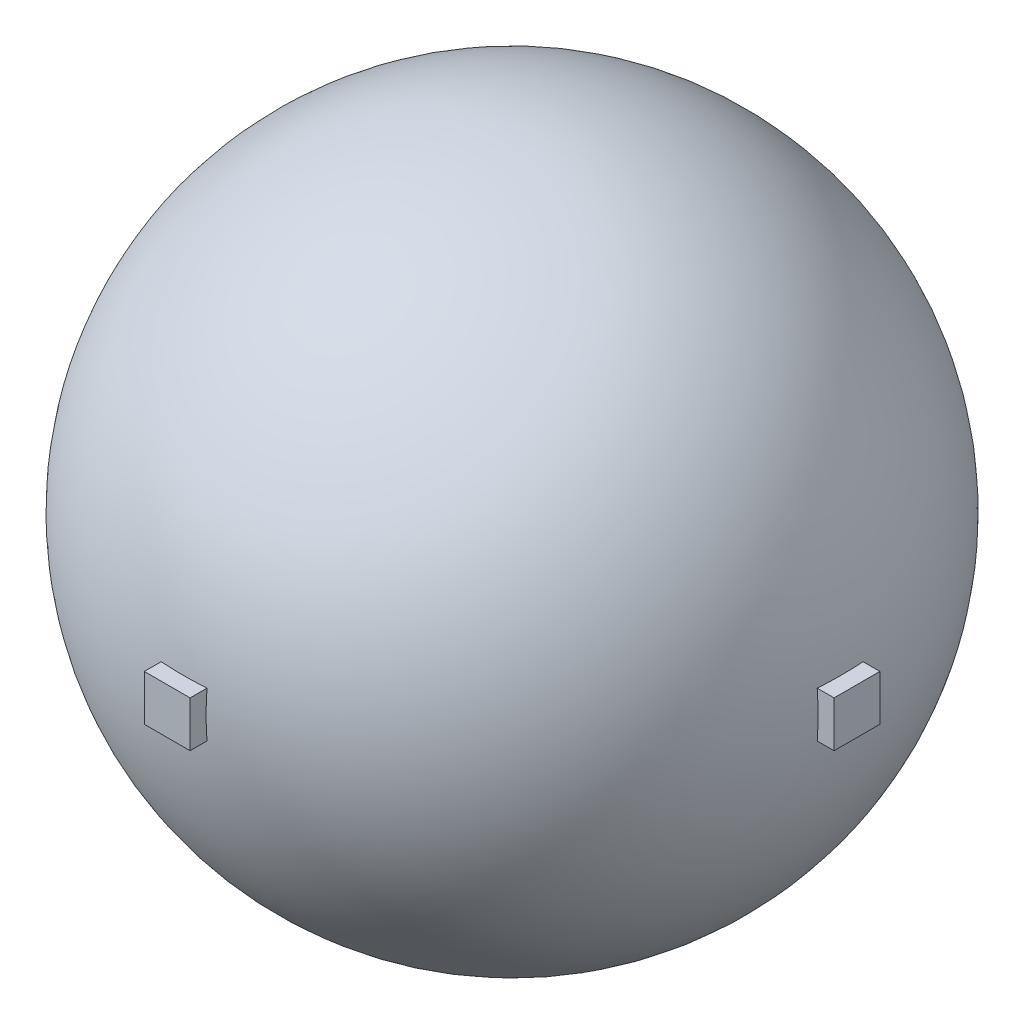
ISO-10303-21;
HEADER;
FILE_DESCRIPTION(('STEP AP214'),'2;1');
FILE_NAME('part.step','',(''),(''),'','','');
FILE_SCHEMA(('AUTOMOTIVE_DESIGN { 1 0 10303 214 1 1 1 1 }'));
ENDSEC;
DATA;
#1=APPLICATION_CONTEXT('core data for automotive mechanical design processes');
#2=APPLICATION_PROTOCOL_DEFINITION('international standard','automotive_design',2000,#1);
#3=PRODUCT_CONTEXT('',#1,'mechanical');
#4=PRODUCT('Part','Part','',(#3));
#5=PRODUCT_RELATED_PRODUCT_CATEGORY('part','',(#4));
#6=PRODUCT_DEFINITION_FORMATION('','',#4);
#7=PRODUCT_DEFINITION_CONTEXT('part definition',#1,'design');
#8=PRODUCT_DEFINITION('design','',#6,#7);
#9=PRODUCT_DEFINITION_SHAPE('','',#8);
#10=(LENGTH_UNIT() NAMED_UNIT(*) SI_UNIT(.MILLI.,.METRE.));
#11=(NAMED_UNIT(*) PLANE_ANGLE_UNIT() SI_UNIT($,.RADIAN.));
#12=(NAMED_UNIT(*) SI_UNIT($,.STERADIAN.) SOLID_ANGLE_UNIT());
#13=UNCERTAINTY_MEASURE_WITH_UNIT(LENGTH_MEASURE(1.E-05),#10,'distance_accuracy_value','');
#14=(GEOMETRIC_REPRESENTATION_CONTEXT(3) GLOBAL_UNCERTAINTY_ASSIGNED_CONTEXT((#13)) GLOBAL_UNIT_ASSIGNED_CONTEXT((#10,
#11,#12)) REPRESENTATION_CONTEXT('',''));
#15=CARTESIAN_POINT('',(0.,0.,0.));
#16=DIRECTION('',(0.,0.,1.));
#17=DIRECTION('',(1.,0.,0.));
#18=AXIS2_PLACEMENT_3D('',#15,#16,#17);
#19=CARTESIAN_POINT('',(0.,0.,287.02));
#20=DIRECTION('',(0.,0.,-1.));
#21=DIRECTION('',(-1.,0.,0.));
#22=AXIS2_PLACEMENT_3D('',#19,#20,#21);
#23=PLANE('',#22);
#24=DIRECTION('',(0.,1.,0.));
#25=VECTOR('',#24,1.);
#26=CARTESIAN_POINT('',(19.05,-19.05,287.02));
#27=LINE('',#26,#25);
#28=CARTESIAN_POINT('',(19.05,-19.05,287.02));
#29=VERTEX_POINT('',#28);
#30=CARTESIAN_POINT('',(19.05,19.05,287.02));
#31=VERTEX_POINT('',#30);
#32=EDGE_CURVE('E249',#29,#31,#27,.T.);
#33=ORIENTED_EDGE('',*,*,#32,.T.);
#34=DIRECTION('',(-1.,0.,0.));
#35=VECTOR('',#34,1.);
#36=CARTESIAN_POINT('',(-19.05,19.05,287.02));
#37=LINE('',#36,#35);
#38=CARTESIAN_POINT('',(-19.05,19.05,287.02));
#39=VERTEX_POINT('',#38);
#40=EDGE_CURVE('E298',#31,#39,#37,.T.);
#41=ORIENTED_EDGE('',*,*,#40,.T.);
#42=DIRECTION('',(0.,-1.,0.));
#43=VECTOR('',#42,1.);
#44=CARTESIAN_POINT('',(-19.05,-19.05,287.02));
#45=LINE('',#44,#43);
#46=CARTESIAN_POINT('',(-19.05,-19.05,287.02));
#47=VERTEX_POINT('',#46);
#48=EDGE_CURVE('E302',#39,#47,#45,.T.);
#49=ORIENTED_EDGE('',*,*,#48,.T.);
#50=DIRECTION('',(1.,0.,0.));
#51=VECTOR('',#50,1.);
#52=CARTESIAN_POINT('',(-19.05,-19.05,287.02));
#53=LINE('',#52,#51);
#54=EDGE_CURVE('E306',#47,#29,#53,.T.);
#55=ORIENTED_EDGE('',*,*,#54,.T.);
#56=EDGE_LOOP('',(#33,#41,#49,#55));
#57=FACE_BOUND('',#56,.T.);
#58=ADVANCED_FACE('F40',(#57),#23,.F.);
#59=CARTESIAN_POINT('',(-19.05,19.05,-274.321));
#60=DIRECTION('',(0.,1.,0.));
#61=DIRECTION('',(0.,0.,1.));
#62=AXIS2_PLACEMENT_3D('',#59,#60,#61);
#63=PLANE('',#62);
#64=DIRECTION('',(0.,0.,1.));
#65=VECTOR('',#64,1.);
#66=CARTESIAN_POINT('',(19.05,19.05,-274.321));
#67=LINE('',#66,#65);
#68=CARTESIAN_POINT('',(19.05,19.05,272.993877953334));
#69=VERTEX_POINT('',#68);
#70=EDGE_CURVE('E310',#69,#31,#67,.T.);
#71=ORIENTED_EDGE('',*,*,#70,.F.);
#72=CARTESIAN_POINT('',(0.,19.05,0.));
#73=DIRECTION('',(0.,1.,0.));
#74=DIRECTION('',(0.,0.,1.));
#75=AXIS2_PLACEMENT_3D('',#72,#73,#74);
#76=CIRCLE('',#75,273.657742262118);
#77=CARTESIAN_POINT('',(-19.05,19.05,272.993877953334));
#78=VERTEX_POINT('',#77);
#79=EDGE_CURVE('E44',#69,#78,#76,.F.);
#80=ORIENTED_EDGE('',*,*,#79,.T.);
#81=DIRECTION('',(0.,0.,1.));
#82=VECTOR('',#81,1.);
#83=CARTESIAN_POINT('',(-19.05,19.05,-274.321));
#84=LINE('',#83,#82);
#85=EDGE_CURVE('E317',#78,#39,#84,.T.);
#86=ORIENTED_EDGE('',*,*,#85,.T.);
#87=ORIENTED_EDGE('',*,*,#40,.F.);
#88=EDGE_LOOP('',(#71,#80,#86,#87));
#89=FACE_BOUND('',#88,.T.);
#90=ADVANCED_FACE('F330',(#89),#63,.T.);
#91=CARTESIAN_POINT('',(-19.05,-19.05,-274.321));
#92=DIRECTION('',(-1.,0.,0.));
#93=DIRECTION('',(0.,0.,1.));
#94=AXIS2_PLACEMENT_3D('',#91,#92,#93);
#95=PLANE('',#94);
#96=ORIENTED_EDGE('',*,*,#85,.F.);
#97=CARTESIAN_POINT('',(-19.05,0.,0.));
#98=DIRECTION('',(-1.,0.,0.));
#99=DIRECTION('',(0.,0.,1.));
#100=AXIS2_PLACEMENT_3D('',#97,#98,#99);
#101=CIRCLE('',#100,273.657742262118);
#102=CARTESIAN_POINT('',(-19.05,-19.05,272.993877953334));
#103=VERTEX_POINT('',#102);
#104=EDGE_CURVE('E289',#78,#103,#101,.F.);
#105=ORIENTED_EDGE('',*,*,#104,.T.);
#106=DIRECTION('',(0.,0.,1.));
#107=VECTOR('',#106,1.);
#108=CARTESIAN_POINT('',(-19.05,-19.05,-274.321));
#109=LINE('',#108,#107);
#110=EDGE_CURVE('E314',#103,#47,#109,.T.);
#111=ORIENTED_EDGE('',*,*,#110,.T.);
#112=ORIENTED_EDGE('',*,*,#48,.F.);
#113=EDGE_LOOP('',(#96,#105,#111,#112));
#114=FACE_BOUND('',#113,.T.);
#115=ADVANCED_FACE('F342',(#114),#95,.T.);
#116=CARTESIAN_POINT('',(-19.05,-19.05,-274.321));
#117=DIRECTION('',(0.,-1.,0.));
#118=DIRECTION('',(0.,0.,-1.));
#119=AXIS2_PLACEMENT_3D('',#116,#117,#118);
#120=PLANE('',#119);
#121=ORIENTED_EDGE('',*,*,#110,.F.);
#122=CARTESIAN_POINT('',(0.,-19.05,0.));
#123=DIRECTION('',(0.,-1.,0.));
#124=DIRECTION('',(0.,0.,-1.));
#125=AXIS2_PLACEMENT_3D('',#122,#123,#124);
#126=CIRCLE('',#125,273.657742262118);
#127=CARTESIAN_POINT('',(19.05,-19.05,272.993877953334));
#128=VERTEX_POINT('',#127);
#129=EDGE_CURVE('E51',#103,#128,#126,.F.);
#130=ORIENTED_EDGE('',*,*,#129,.T.);
#131=DIRECTION('',(0.,0.,1.));
#132=VECTOR('',#131,1.);
#133=CARTESIAN_POINT('',(19.05,-19.05,-274.321));
#134=LINE('',#133,#132);
#135=EDGE_CURVE('E311',#128,#29,#134,.T.);
#136=ORIENTED_EDGE('',*,*,#135,.T.);
#137=ORIENTED_EDGE('',*,*,#54,.F.);
#138=EDGE_LOOP('',(#121,#130,#136,#137));
#139=FACE_BOUND('',#138,.T.);
#140=ADVANCED_FACE('F335',(#139),#120,.T.);
#141=CARTESIAN_POINT('',(19.05,-19.05,-274.321));
#142=DIRECTION('',(1.,0.,0.));
#143=DIRECTION('',(0.,0.,-1.));
#144=AXIS2_PLACEMENT_3D('',#141,#142,#143);
#145=PLANE('',#144);
#146=ORIENTED_EDGE('',*,*,#135,.F.);
#147=CARTESIAN_POINT('',(19.05,0.,0.));
#148=DIRECTION('',(1.,0.,0.));
#149=DIRECTION('',(0.,0.,-1.));
#150=AXIS2_PLACEMENT_3D('',#147,#148,#149);
#151=CIRCLE('',#150,273.657742262118);
#152=EDGE_CURVE('E11',#128,#69,#151,.F.);
#153=ORIENTED_EDGE('',*,*,#152,.T.);
#154=ORIENTED_EDGE('',*,*,#70,.T.);
#155=ORIENTED_EDGE('',*,*,#32,.F.);
#156=EDGE_LOOP('',(#146,#153,#154,#155));
#157=FACE_BOUND('',#156,.T.);
#158=ADVANCED_FACE('F325',(#157),#145,.T.);
#159=CARTESIAN_POINT('',(0.,0.,0.));
#160=DIRECTION('',(-1.,0.,0.));
#161=DIRECTION('',(0.,0.,-1.));
#162=AXIS2_PLACEMENT_3D('',#159,#160,#161);
#163=SPHERICAL_SURFACE('',#162,274.32);
#164=CARTESIAN_POINT('',(-1.99538158514885E-13,0.,19.05));
#165=DIRECTION('',(0.,0.,1.));
#166=DIRECTION('',(1.,0.,0.));
#167=AXIS2_PLACEMENT_3D('',#164,#165,#166);
#168=CIRCLE('',#167,273.657742262118);
#169=CARTESIAN_POINT('',(272.993877953334,19.05,19.0500000000029));
#170=VERTEX_POINT('',#169);
#171=CARTESIAN_POINT('',(272.993877953334,-19.05,19.0500000000029));
#172=VERTEX_POINT('',#171);
#173=EDGE_CURVE('E202',#170,#172,#168,.F.);
#174=ORIENTED_EDGE('',*,*,#173,.F.);
#175=CARTESIAN_POINT('',(0.,19.05,0.));
#176=DIRECTION('',(0.,1.,0.));
#177=DIRECTION('',(0.,0.,1.));
#178=AXIS2_PLACEMENT_3D('',#175,#176,#177);
#179=CIRCLE('',#178,273.657742262118);
#180=CARTESIAN_POINT('',(272.993877953335,19.05,-19.0499999999971));
#181=VERTEX_POINT('',#180);
#182=EDGE_CURVE('E194',#181,#170,#179,.F.);
#183=ORIENTED_EDGE('',*,*,#182,.F.);
#184=CARTESIAN_POINT('',(1.99538158514885E-13,0.,-19.05));
#185=DIRECTION('',(0.,0.,-1.));
#186=DIRECTION('',(-1.,0.,0.));
#187=AXIS2_PLACEMENT_3D('',#184,#185,#186);
#188=CIRCLE('',#187,273.657742262118);
#189=CARTESIAN_POINT('',(272.993877953335,-19.05,-19.0499999999971));
#190=VERTEX_POINT('',#189);
#191=EDGE_CURVE('E163',#190,#181,#188,.F.);
#192=ORIENTED_EDGE('',*,*,#191,.F.);
#193=CARTESIAN_POINT('',(0.,-19.05,0.));
#194=DIRECTION('',(0.,-1.,0.));
#195=DIRECTION('',(0.,0.,-1.));
#196=AXIS2_PLACEMENT_3D('',#193,#194,#195);
#197=CIRCLE('',#196,273.657742262118);
#198=EDGE_CURVE('E59',#172,#190,#197,.F.);
#199=ORIENTED_EDGE('',*,*,#198,.F.);
#200=EDGE_LOOP('',(#174,#183,#192,#199));
#201=FACE_BOUND('',#200,.T.);
#202=CARTESIAN_POINT('',(19.05,0.,0.));
#203=DIRECTION('',(1.,0.,0.));
#204=DIRECTION('',(0.,0.,-1.));
#205=AXIS2_PLACEMENT_3D('',#202,#203,#204);
#206=CIRCLE('',#205,273.657742262118);
#207=CARTESIAN_POINT('',(19.05,19.05,-272.993877953334));
#208=VERTEX_POINT('',#207);
#209=CARTESIAN_POINT('',(19.05,-19.05,-272.993877953334));
#210=VERTEX_POINT('',#209);
#211=EDGE_CURVE('E203',#208,#210,#206,.F.);
#212=ORIENTED_EDGE('',*,*,#211,.F.);
#213=CARTESIAN_POINT('',(0.,19.05,0.));
#214=DIRECTION('',(0.,1.,0.));
#215=DIRECTION('',(0.,0.,1.));
#216=AXIS2_PLACEMENT_3D('',#213,#214,#215);
#217=CIRCLE('',#216,273.657742262118);
#218=CARTESIAN_POINT('',(-19.05,19.05,-272.993877953334));
#219=VERTEX_POINT('',#218);
#220=EDGE_CURVE('E207',#219,#208,#217,.F.);
#221=ORIENTED_EDGE('',*,*,#220,.F.);
#222=CARTESIAN_POINT('',(-19.05,0.,0.));
#223=DIRECTION('',(-1.,0.,0.));
#224=DIRECTION('',(0.,0.,1.));
#225=AXIS2_PLACEMENT_3D('',#222,#223,#224);
#226=CIRCLE('',#225,273.657742262118);
#227=CARTESIAN_POINT('',(-19.05,-19.05,-272.993877953334));
#228=VERTEX_POINT('',#227);
#229=EDGE_CURVE('E210',#228,#219,#226,.F.);
#230=ORIENTED_EDGE('',*,*,#229,.F.);
#231=CARTESIAN_POINT('',(0.,-19.05,0.));
#232=DIRECTION('',(0.,-1.,0.));
#233=DIRECTION('',(0.,0.,-1.));
#234=AXIS2_PLACEMENT_3D('',#231,#232,#233);
#235=CIRCLE('',#234,273.657742262118);
#236=EDGE_CURVE('E67',#210,#228,#235,.F.);
#237=ORIENTED_EDGE('',*,*,#236,.F.);
#238=EDGE_LOOP('',(#212,#221,#230,#237));
#239=FACE_BOUND('',#238,.T.);
#240=CARTESIAN_POINT('',(0.,19.05,0.));
#241=DIRECTION('',(0.,1.,0.));
#242=DIRECTION('',(0.,0.,1.));
#243=AXIS2_PLACEMENT_3D('',#240,#241,#242);
#244=CIRCLE('',#243,273.657742262118);
#245=CARTESIAN_POINT('',(-272.993877953334,19.05,19.049999999999));
#246=VERTEX_POINT('',#245);
#247=CARTESIAN_POINT('',(-272.993877953334,19.05,-19.050000000001));
#248=VERTEX_POINT('',#247);
#249=EDGE_CURVE('E271',#246,#248,#244,.F.);
#250=ORIENTED_EDGE('',*,*,#249,.F.);
#251=CARTESIAN_POINT('',(0.,0.,19.05));
#252=DIRECTION('',(0.,0.,1.));
#253=DIRECTION('',(1.,0.,0.));
#254=AXIS2_PLACEMENT_3D('',#251,#252,#253);
#255=CIRCLE('',#254,273.657742262118);
#256=CARTESIAN_POINT('',(-272.993877953334,-19.05,19.049999999999));
#257=VERTEX_POINT('',#256);
#258=EDGE_CURVE('E213',#257,#246,#255,.F.);
#259=ORIENTED_EDGE('',*,*,#258,.F.);
#260=CARTESIAN_POINT('',(0.,-19.05,0.));
#261=DIRECTION('',(0.,-1.,0.));
#262=DIRECTION('',(0.,0.,-1.));
#263=AXIS2_PLACEMENT_3D('',#260,#261,#262);
#264=CIRCLE('',#263,273.657742262118);
#265=CARTESIAN_POINT('',(-272.993877953334,-19.05,-19.050000000001));
#266=VERTEX_POINT('',#265);
#267=EDGE_CURVE('E267',#266,#257,#264,.F.);
#268=ORIENTED_EDGE('',*,*,#267,.F.);
#269=CARTESIAN_POINT('',(0.,0.,-19.05));
#270=DIRECTION('',(0.,0.,-1.));
#271=DIRECTION('',(-1.,0.,0.));
#272=AXIS2_PLACEMENT_3D('',#269,#270,#271);
#273=CIRCLE('',#272,273.657742262118);
#274=EDGE_CURVE('E266',#248,#266,#273,.F.);
#275=ORIENTED_EDGE('',*,*,#274,.F.);
#276=EDGE_LOOP('',(#250,#259,#268,#275));
#277=FACE_BOUND('',#276,.T.);
#278=ORIENTED_EDGE('',*,*,#104,.F.);
#279=ORIENTED_EDGE('',*,*,#79,.F.);
#280=ORIENTED_EDGE('',*,*,#152,.F.);
#281=ORIENTED_EDGE('',*,*,#129,.F.);
#282=EDGE_LOOP('',(#278,#279,#280,#281));
#283=FACE_BOUND('',#282,.T.);
#284=ADVANCED_FACE('F339',(#201,#239,#277,#283),#163,.T.);
#285=CARTESIAN_POINT('',(274.321000000001,-19.05,19.050000000001));
#286=DIRECTION('',(0.,0.,1.));
#287=DIRECTION('',(1.,0.,0.));
#288=AXIS2_PLACEMENT_3D('',#285,#286,#287);
#289=PLANE('',#288);
#290=DIRECTION('',(-1.,0.,0.));
#291=VECTOR('',#290,1.);
#292=CARTESIAN_POINT('',(274.321000000001,-19.05,19.050000000001));
#293=LINE('',#292,#291);
#294=CARTESIAN_POINT('',(-287.02,-19.05,19.049999999999));
#295=VERTEX_POINT('',#294);
#296=EDGE_CURVE('E263',#257,#295,#293,.T.);
#297=ORIENTED_EDGE('',*,*,#296,.F.);
#298=ORIENTED_EDGE('',*,*,#258,.T.);
#299=DIRECTION('',(-1.,0.,0.));
#300=VECTOR('',#299,1.);
#301=CARTESIAN_POINT('',(274.321000000001,19.05,19.050000000001));
#302=LINE('',#301,#300);
#303=CARTESIAN_POINT('',(-287.02,19.05,19.049999999999));
#304=VERTEX_POINT('',#303);
#305=EDGE_CURVE('E274',#246,#304,#302,.T.);
#306=ORIENTED_EDGE('',*,*,#305,.T.);
#307=DIRECTION('',(0.,1.,0.));
#308=VECTOR('',#307,1.);
#309=CARTESIAN_POINT('',(-287.02,-19.05,19.049999999999));
#310=LINE('',#309,#308);
#311=EDGE_CURVE('E258',#295,#304,#310,.T.);
#312=ORIENTED_EDGE('',*,*,#311,.F.);
#313=EDGE_LOOP('',(#297,#298,#306,#312));
#314=FACE_BOUND('',#313,.T.);
#315=ADVANCED_FACE('F368',(#314),#289,.T.);
#316=CARTESIAN_POINT('',(274.321000000001,-19.05,-19.049999999999));
#317=DIRECTION('',(0.,-1.,0.));
#318=DIRECTION('',(0.,0.,-1.));
#319=AXIS2_PLACEMENT_3D('',#316,#317,#318);
#320=PLANE('',#319);
#321=DIRECTION('',(-1.,0.,0.));
#322=VECTOR('',#321,1.);
#323=CARTESIAN_POINT('',(274.321000000001,-19.05,-19.049999999999));
#324=LINE('',#323,#322);
#325=CARTESIAN_POINT('',(-287.02,-19.05,-19.050000000001));
#326=VERTEX_POINT('',#325);
#327=EDGE_CURVE('E268',#266,#326,#324,.T.);
#328=ORIENTED_EDGE('',*,*,#327,.F.);
#329=ORIENTED_EDGE('',*,*,#267,.T.);
#330=ORIENTED_EDGE('',*,*,#296,.T.);
#331=DIRECTION('',(0.,0.,1.));
#332=VECTOR('',#331,1.);
#333=CARTESIAN_POINT('',(-287.02,-19.05,-19.050000000001));
#334=LINE('',#333,#332);
#335=EDGE_CURVE('E245',#326,#295,#334,.T.);
#336=ORIENTED_EDGE('',*,*,#335,.F.);
#337=EDGE_LOOP('',(#328,#329,#330,#336));
#338=FACE_BOUND('',#337,.T.);
#339=ADVANCED_FACE('F364',(#338),#320,.T.);
#340=CARTESIAN_POINT('',(274.321000000001,-19.05,-19.049999999999));
#341=DIRECTION('',(0.,0.,-1.));
#342=DIRECTION('',(-1.,0.,0.));
#343=AXIS2_PLACEMENT_3D('',#340,#341,#342);
#344=PLANE('',#343);
#345=DIRECTION('',(-1.,0.,0.));
#346=VECTOR('',#345,1.);
#347=CARTESIAN_POINT('',(274.321000000001,19.05,-19.049999999999));
#348=LINE('',#347,#346);
#349=CARTESIAN_POINT('',(-287.02,19.05,-19.050000000001));
#350=VERTEX_POINT('',#349);
#351=EDGE_CURVE('E262',#248,#350,#348,.T.);
#352=ORIENTED_EDGE('',*,*,#351,.F.);
#353=ORIENTED_EDGE('',*,*,#274,.T.);
#354=ORIENTED_EDGE('',*,*,#327,.T.);
#355=DIRECTION('',(0.,-1.,0.));
#356=VECTOR('',#355,1.);
#357=CARTESIAN_POINT('',(-287.02,-19.05,-19.050000000001));
#358=LINE('',#357,#356);
#359=EDGE_CURVE('E250',#350,#326,#358,.T.);
#360=ORIENTED_EDGE('',*,*,#359,.F.);
#361=EDGE_LOOP('',(#352,#353,#354,#360));
#362=FACE_BOUND('',#361,.T.);
#363=ADVANCED_FACE('F360',(#362),#344,.T.);
#364=CARTESIAN_POINT('',(274.321000000001,19.05,-19.049999999999));
#365=DIRECTION('',(0.,1.,0.));
#366=DIRECTION('',(0.,0.,1.));
#367=AXIS2_PLACEMENT_3D('',#364,#365,#366);
#368=PLANE('',#367);
#369=ORIENTED_EDGE('',*,*,#305,.F.);
#370=ORIENTED_EDGE('',*,*,#249,.T.);
#371=ORIENTED_EDGE('',*,*,#351,.T.);
#372=DIRECTION('',(0.,0.,-1.));
#373=VECTOR('',#372,1.);
#374=CARTESIAN_POINT('',(-287.02,19.05,-19.050000000001));
#375=LINE('',#374,#373);
#376=EDGE_CURVE('E254',#304,#350,#375,.T.);
#377=ORIENTED_EDGE('',*,*,#376,.F.);
#378=EDGE_LOOP('',(#369,#370,#371,#377));
#379=FACE_BOUND('',#378,.T.);
#380=ADVANCED_FACE('F356',(#379),#368,.T.);
#381=CARTESIAN_POINT('',(-287.02,0.,-1.00212497387476E-12));
#382=DIRECTION('',(1.,0.,0.));
#383=DIRECTION('',(0.,0.,-1.));
#384=AXIS2_PLACEMENT_3D('',#381,#382,#383);
#385=PLANE('',#384);
#386=ORIENTED_EDGE('',*,*,#311,.T.);
#387=ORIENTED_EDGE('',*,*,#376,.T.);
#388=ORIENTED_EDGE('',*,*,#359,.T.);
#389=ORIENTED_EDGE('',*,*,#335,.T.);
#390=EDGE_LOOP('',(#386,#387,#388,#389));
#391=FACE_BOUND('',#390,.T.);
#392=ADVANCED_FACE('F359',(#391),#385,.F.);
#393=CARTESIAN_POINT('',(0.,0.,-287.02));
#394=DIRECTION('',(0.,0.,1.));
#395=DIRECTION('',(1.,0.,0.));
#396=AXIS2_PLACEMENT_3D('',#393,#394,#395);
#397=PLANE('',#396);
#398=DIRECTION('',(0.,1.,0.));
#399=VECTOR('',#398,1.);
#400=CARTESIAN_POINT('',(-19.05,-19.05,-287.02));
#401=LINE('',#400,#399);
#402=CARTESIAN_POINT('',(-19.05,-19.05,-287.02));
#403=VERTEX_POINT('',#402);
#404=CARTESIAN_POINT('',(-19.05,19.05,-287.02));
#405=VERTEX_POINT('',#404);
#406=EDGE_CURVE('E214',#403,#405,#401,.T.);
#407=ORIENTED_EDGE('',*,*,#406,.T.);
#408=DIRECTION('',(1.,0.,0.));
#409=VECTOR('',#408,1.);
#410=CARTESIAN_POINT('',(19.05,19.05,-287.02));
#411=LINE('',#410,#409);
#412=CARTESIAN_POINT('',(19.05,19.05,-287.02));
#413=VERTEX_POINT('',#412);
#414=EDGE_CURVE('E218',#405,#413,#411,.T.);
#415=ORIENTED_EDGE('',*,*,#414,.T.);
#416=DIRECTION('',(0.,-1.,0.));
#417=VECTOR('',#416,1.);
#418=CARTESIAN_POINT('',(19.05,-19.05,-287.02));
#419=LINE('',#418,#417);
#420=CARTESIAN_POINT('',(19.05,-19.05,-287.02));
#421=VERTEX_POINT('',#420);
#422=EDGE_CURVE('E222',#413,#421,#419,.T.);
#423=ORIENTED_EDGE('',*,*,#422,.T.);
#424=DIRECTION('',(-1.,0.,0.));
#425=VECTOR('',#424,1.);
#426=CARTESIAN_POINT('',(19.05,-19.05,-287.02));
#427=LINE('',#426,#425);
#428=EDGE_CURVE('E226',#421,#403,#427,.T.);
#429=ORIENTED_EDGE('',*,*,#428,.T.);
#430=EDGE_LOOP('',(#407,#415,#423,#429));
#431=FACE_BOUND('',#430,.T.);
#432=ADVANCED_FACE('F375',(#431),#397,.F.);
#433=CARTESIAN_POINT('',(19.05,19.05,287.021));
#434=DIRECTION('',(0.,1.,0.));
#435=DIRECTION('',(0.,0.,1.));
#436=AXIS2_PLACEMENT_3D('',#433,#434,#435);
#437=PLANE('',#436);
#438=DIRECTION('',(0.,0.,-1.));
#439=VECTOR('',#438,1.);
#440=CARTESIAN_POINT('',(-19.05,19.05,287.021));
#441=LINE('',#440,#439);
#442=EDGE_CURVE('E230',#219,#405,#441,.T.);
#443=ORIENTED_EDGE('',*,*,#442,.F.);
#444=ORIENTED_EDGE('',*,*,#220,.T.);
#445=DIRECTION('',(0.,0.,-1.));
#446=VECTOR('',#445,1.);
#447=CARTESIAN_POINT('',(19.05,19.05,287.021));
#448=LINE('',#447,#446);
#449=EDGE_CURVE('E237',#208,#413,#448,.T.);
#450=ORIENTED_EDGE('',*,*,#449,.T.);
#451=ORIENTED_EDGE('',*,*,#414,.F.);
#452=EDGE_LOOP('',(#443,#444,#450,#451));
#453=FACE_BOUND('',#452,.T.);
#454=ADVANCED_FACE('F382',(#453),#437,.T.);
#455=CARTESIAN_POINT('',(19.05,-19.05,287.021));
#456=DIRECTION('',(1.,0.,0.));
#457=DIRECTION('',(0.,0.,-1.));
#458=AXIS2_PLACEMENT_3D('',#455,#456,#457);
#459=PLANE('',#458);
#460=ORIENTED_EDGE('',*,*,#449,.F.);
#461=ORIENTED_EDGE('',*,*,#211,.T.);
#462=DIRECTION('',(0.,0.,-1.));
#463=VECTOR('',#462,1.);
#464=CARTESIAN_POINT('',(19.05,-19.05,287.021));
#465=LINE('',#464,#463);
#466=EDGE_CURVE('E234',#210,#421,#465,.T.);
#467=ORIENTED_EDGE('',*,*,#466,.T.);
#468=ORIENTED_EDGE('',*,*,#422,.F.);
#469=EDGE_LOOP('',(#460,#461,#467,#468));
#470=FACE_BOUND('',#469,.T.);
#471=ADVANCED_FACE('F385',(#470),#459,.T.);
#472=CARTESIAN_POINT('',(19.05,-19.05,287.021));
#473=DIRECTION('',(0.,-1.,0.));
#474=DIRECTION('',(0.,0.,-1.));
#475=AXIS2_PLACEMENT_3D('',#472,#473,#474);
#476=PLANE('',#475);
#477=ORIENTED_EDGE('',*,*,#466,.F.);
#478=ORIENTED_EDGE('',*,*,#236,.T.);
#479=DIRECTION('',(0.,0.,-1.));
#480=VECTOR('',#479,1.);
#481=CARTESIAN_POINT('',(-19.05,-19.05,287.021));
#482=LINE('',#481,#480);
#483=EDGE_CURVE('E231',#228,#403,#482,.T.);
#484=ORIENTED_EDGE('',*,*,#483,.T.);
#485=ORIENTED_EDGE('',*,*,#428,.F.);
#486=EDGE_LOOP('',(#477,#478,#484,#485));
#487=FACE_BOUND('',#486,.T.);
#488=ADVANCED_FACE('F380',(#487),#476,.T.);
#489=CARTESIAN_POINT('',(-19.05,-19.05,287.021));
#490=DIRECTION('',(-1.,0.,0.));
#491=DIRECTION('',(0.,0.,1.));
#492=AXIS2_PLACEMENT_3D('',#489,#490,#491);
#493=PLANE('',#492);
#494=ORIENTED_EDGE('',*,*,#483,.F.);
#495=ORIENTED_EDGE('',*,*,#229,.T.);
#496=ORIENTED_EDGE('',*,*,#442,.T.);
#497=ORIENTED_EDGE('',*,*,#406,.F.);
#498=EDGE_LOOP('',(#494,#495,#496,#497));
#499=FACE_BOUND('',#498,.T.);
#500=ADVANCED_FACE('F377',(#499),#493,.T.);
#501=CARTESIAN_POINT('',(287.02,0.,3.00637492162427E-12));
#502=DIRECTION('',(-1.,0.,0.));
#503=DIRECTION('',(0.,0.,1.));
#504=AXIS2_PLACEMENT_3D('',#501,#502,#503);
#505=PLANE('',#504);
#506=DIRECTION('',(0.,1.,0.));
#507=VECTOR('',#506,1.);
#508=CARTESIAN_POINT('',(287.02,-19.05,-19.049999999997));
#509=LINE('',#508,#507);
#510=CARTESIAN_POINT('',(287.02,-19.05,-19.049999999997));
#511=VERTEX_POINT('',#510);
#512=CARTESIAN_POINT('',(287.02,19.05,-19.049999999997));
#513=VERTEX_POINT('',#512);
#514=EDGE_CURVE('E160',#511,#513,#509,.T.);
#515=ORIENTED_EDGE('',*,*,#514,.T.);
#516=DIRECTION('',(0.,0.,1.));
#517=VECTOR('',#516,1.);
#518=CARTESIAN_POINT('',(287.02,19.05,19.050000000003));
#519=LINE('',#518,#517);
#520=CARTESIAN_POINT('',(287.02,19.05,19.050000000003));
#521=VERTEX_POINT('',#520);
#522=EDGE_CURVE('E172',#513,#521,#519,.T.);
#523=ORIENTED_EDGE('',*,*,#522,.T.);
#524=DIRECTION('',(0.,-1.,0.));
#525=VECTOR('',#524,1.);
#526=CARTESIAN_POINT('',(287.02,-19.05,19.050000000003));
#527=LINE('',#526,#525);
#528=CARTESIAN_POINT('',(287.02,-19.05,19.050000000003));
#529=VERTEX_POINT('',#528);
#530=EDGE_CURVE('E178',#521,#529,#527,.T.);
#531=ORIENTED_EDGE('',*,*,#530,.T.);
#532=DIRECTION('',(0.,0.,-1.));
#533=VECTOR('',#532,1.);
#534=CARTESIAN_POINT('',(287.02,-19.05,19.050000000003));
#535=LINE('',#534,#533);
#536=EDGE_CURVE('E169',#529,#511,#535,.T.);
#537=ORIENTED_EDGE('',*,*,#536,.T.);
#538=EDGE_LOOP('',(#515,#523,#531,#537));
#539=FACE_BOUND('',#538,.T.);
#540=ADVANCED_FACE('F180',(#539),#505,.F.);
#541=CARTESIAN_POINT('',(-274.321000000003,19.05,19.0499999999971));
#542=DIRECTION('',(0.,1.,0.));
#543=DIRECTION('',(0.,0.,1.));
#544=AXIS2_PLACEMENT_3D('',#541,#542,#543);
#545=PLANE('',#544);
#546=DIRECTION('',(1.,0.,0.));
#547=VECTOR('',#546,1.);
#548=CARTESIAN_POINT('',(-274.321000000003,19.05,-19.0500000000029));
#549=LINE('',#548,#547);
#550=EDGE_CURVE('E156',#181,#513,#549,.T.);
#551=ORIENTED_EDGE('',*,*,#550,.F.);
#552=ORIENTED_EDGE('',*,*,#182,.T.);
#553=DIRECTION('',(1.,0.,0.));
#554=VECTOR('',#553,1.);
#555=CARTESIAN_POINT('',(-274.321000000003,19.05,19.0499999999971));
#556=LINE('',#555,#554);
#557=EDGE_CURVE('E168',#170,#521,#556,.T.);
#558=ORIENTED_EDGE('',*,*,#557,.T.);
#559=ORIENTED_EDGE('',*,*,#522,.F.);
#560=EDGE_LOOP('',(#551,#552,#558,#559));
#561=FACE_BOUND('',#560,.T.);
#562=ADVANCED_FACE('F173',(#561),#545,.T.);
#563=CARTESIAN_POINT('',(-274.321000000003,-19.05,19.0499999999971));
#564=DIRECTION('',(0.,0.,1.));
#565=DIRECTION('',(1.,0.,0.));
#566=AXIS2_PLACEMENT_3D('',#563,#564,#565);
#567=PLANE('',#566);
#568=ORIENTED_EDGE('',*,*,#557,.F.);
#569=ORIENTED_EDGE('',*,*,#173,.T.);
#570=DIRECTION('',(1.,0.,0.));
#571=VECTOR('',#570,1.);
#572=CARTESIAN_POINT('',(-274.321000000003,-19.05,19.0499999999971));
#573=LINE('',#572,#571);
#574=EDGE_CURVE('E195',#172,#529,#573,.T.);
#575=ORIENTED_EDGE('',*,*,#574,.T.);
#576=ORIENTED_EDGE('',*,*,#530,.F.);
#577=EDGE_LOOP('',(#568,#569,#575,#576));
#578=FACE_BOUND('',#577,.T.);
#579=ADVANCED_FACE('F400',(#578),#567,.T.);
#580=CARTESIAN_POINT('',(-274.321000000003,-19.05,19.0499999999971));
#581=DIRECTION('',(0.,-1.,0.));
#582=DIRECTION('',(0.,0.,-1.));
#583=AXIS2_PLACEMENT_3D('',#580,#581,#582);
#584=PLANE('',#583);
#585=ORIENTED_EDGE('',*,*,#574,.F.);
#586=ORIENTED_EDGE('',*,*,#198,.T.);
#587=DIRECTION('',(1.,0.,0.));
#588=VECTOR('',#587,1.);
#589=CARTESIAN_POINT('',(-274.321000000003,-19.05,-19.0500000000029));
#590=LINE('',#589,#588);
#591=EDGE_CURVE('E191',#190,#511,#590,.T.);
#592=ORIENTED_EDGE('',*,*,#591,.T.);
#593=ORIENTED_EDGE('',*,*,#536,.F.);
#594=EDGE_LOOP('',(#585,#586,#592,#593));
#595=FACE_BOUND('',#594,.T.);
#596=ADVANCED_FACE('F397',(#595),#584,.T.);
#597=CARTESIAN_POINT('',(-274.321000000003,-19.05,-19.0500000000029));
#598=DIRECTION('',(0.,0.,-1.));
#599=DIRECTION('',(-1.,0.,0.));
#600=AXIS2_PLACEMENT_3D('',#597,#598,#599);
#601=PLANE('',#600);
#602=ORIENTED_EDGE('',*,*,#591,.F.);
#603=ORIENTED_EDGE('',*,*,#191,.T.);
#604=ORIENTED_EDGE('',*,*,#550,.T.);
#605=ORIENTED_EDGE('',*,*,#514,.F.);
#606=EDGE_LOOP('',(#602,#603,#604,#605));
#607=FACE_BOUND('',#606,.T.);
#608=ADVANCED_FACE('F158',(#607),#601,.T.);
#609=CLOSED_SHELL('',(#58,#90,#115,#140,#158,#284,#315,#339,#363,#380,#392,#432,#454,#471,#488,
#500,#540,#562,#579,#596,#608));
#610=CARTESIAN_POINT('',(0.,0.,0.));
#611=DIRECTION('',(-1.,0.,0.));
#612=DIRECTION('',(0.,0.,-1.));
#613=AXIS2_PLACEMENT_3D('',#610,#611,#612);
#614=SPHERICAL_SURFACE('',#613,271.145);
#615=CARTESIAN_POINT('',(-271.145,0.,0.));
#616=VERTEX_POINT('',#615);
#617=VERTEX_LOOP('',#616);
#618=FACE_BOUND('',#617,.T.);
#619=ADVANCED_FACE('F42',(#618),#614,.F.);
#620=CLOSED_SHELL('',(#619));
#621=ORIENTED_CLOSED_SHELL('',*,#620,.T.);
#622=BREP_WITH_VOIDS('B2',#609,(#621));
#623=ADVANCED_BREP_SHAPE_REPRESENTATION('',(#18,#622),#14);
#624=SHAPE_DEFINITION_REPRESENTATION(#9,#623);
ENDSEC;
END-ISO-10303-21;
